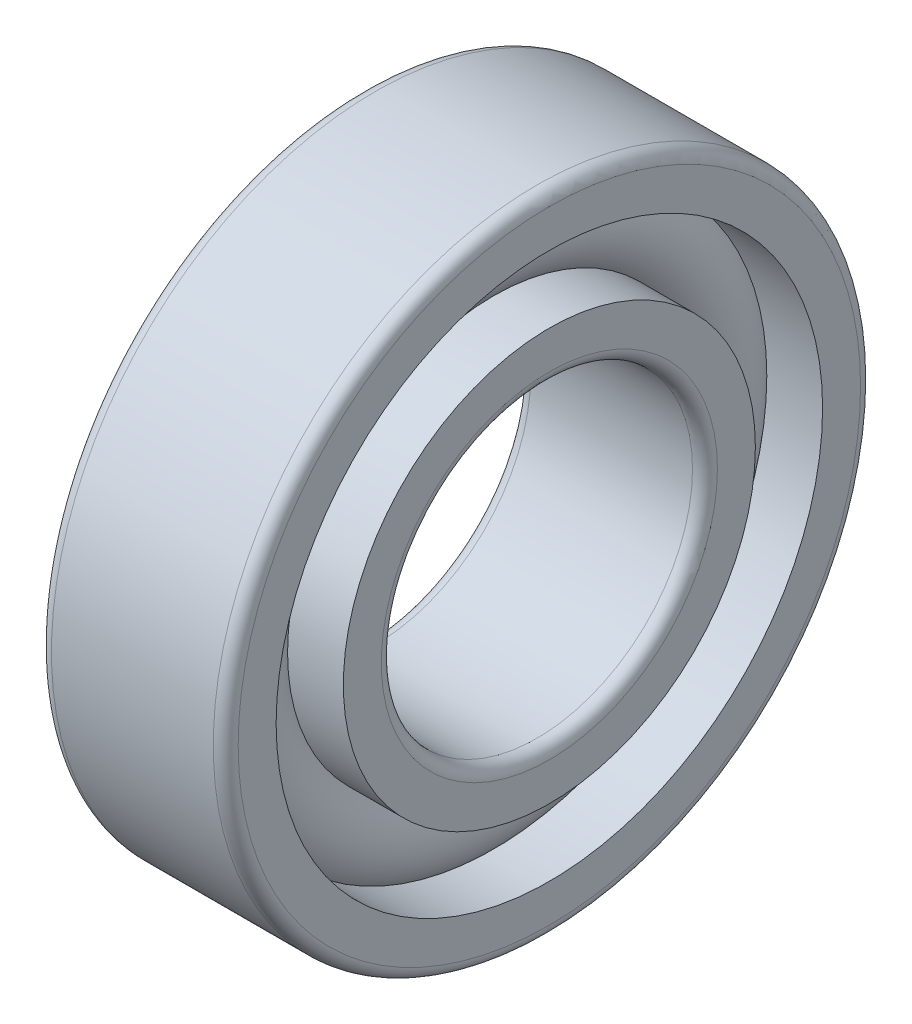
ISO-10303-21;
HEADER;
FILE_DESCRIPTION(('STEP AP214'),'2;1');
FILE_NAME('part.step','',(''),(''),'','','');
FILE_SCHEMA(('AUTOMOTIVE_DESIGN { 1 0 10303 214 1 1 1 1 }'));
ENDSEC;
DATA;
#1=APPLICATION_CONTEXT('core data for automotive mechanical design processes');
#2=APPLICATION_PROTOCOL_DEFINITION('international standard','automotive_design',2000,#1);
#3=PRODUCT_CONTEXT('',#1,'mechanical');
#4=PRODUCT('Part','Part','',(#3));
#5=PRODUCT_RELATED_PRODUCT_CATEGORY('part','',(#4));
#6=PRODUCT_DEFINITION_FORMATION('','',#4);
#7=PRODUCT_DEFINITION_CONTEXT('part definition',#1,'design');
#8=PRODUCT_DEFINITION('design','',#6,#7);
#9=PRODUCT_DEFINITION_SHAPE('','',#8);
#10=(LENGTH_UNIT() NAMED_UNIT(*) SI_UNIT(.MILLI.,.METRE.));
#11=(NAMED_UNIT(*) PLANE_ANGLE_UNIT() SI_UNIT($,.RADIAN.));
#12=(NAMED_UNIT(*) SI_UNIT($,.STERADIAN.) SOLID_ANGLE_UNIT());
#13=UNCERTAINTY_MEASURE_WITH_UNIT(LENGTH_MEASURE(1.E-05),#10,'distance_accuracy_value','');
#14=(GEOMETRIC_REPRESENTATION_CONTEXT(3) GLOBAL_UNCERTAINTY_ASSIGNED_CONTEXT((#13)) GLOBAL_UNIT_ASSIGNED_CONTEXT((#10,
#11,#12)) REPRESENTATION_CONTEXT('',''));
#15=CARTESIAN_POINT('',(0.,0.,0.));
#16=DIRECTION('',(0.,0.,1.));
#17=DIRECTION('',(1.,0.,0.));
#18=AXIS2_PLACEMENT_3D('',#15,#16,#17);
#19=CARTESIAN_POINT('',(0.,0.,0.));
#20=DIRECTION('',(-1.,0.,0.));
#21=DIRECTION('',(0.,0.,1.));
#22=AXIS2_PLACEMENT_3D('',#19,#20,#21);
#23=TOROIDAL_SURFACE('',#22,19.25,4.05);
#24=CARTESIAN_POINT('',(3.01869176962471,0.,0.));
#25=DIRECTION('',(-1.,0.,0.));
#26=DIRECTION('',(0.,0.,1.));
#27=AXIS2_PLACEMENT_3D('',#24,#25,#26);
#28=CIRCLE('',#27,21.95);
#29=CARTESIAN_POINT('',(3.01869176962471,0.,21.95));
#30=VERTEX_POINT('',#29);
#31=EDGE_CURVE('E35',#30,#30,#28,.F.);
#32=ORIENTED_EDGE('',*,*,#31,.T.);
#33=EDGE_LOOP('',(#32));
#34=FACE_BOUND('',#33,.T.);
#35=CARTESIAN_POINT('',(3.01869176962472,0.,0.));
#36=DIRECTION('',(-1.,0.,0.));
#37=DIRECTION('',(0.,0.,1.));
#38=AXIS2_PLACEMENT_3D('',#35,#36,#37);
#39=CIRCLE('',#38,16.55);
#40=CARTESIAN_POINT('',(3.01869176962472,0.,16.55));
#41=VERTEX_POINT('',#40);
#42=EDGE_CURVE('E10',#41,#41,#39,.T.);
#43=ORIENTED_EDGE('',*,*,#42,.T.);
#44=EDGE_LOOP('',(#43));
#45=FACE_BOUND('',#44,.T.);
#46=ADVANCED_FACE('F31',(#34,#45),#23,.T.);
#47=CARTESIAN_POINT('',(-20.6375,0.,0.));
#48=DIRECTION('',(1.,0.,0.));
#49=DIRECTION('',(0.,0.,-1.));
#50=AXIS2_PLACEMENT_3D('',#47,#48,#49);
#51=CYLINDRICAL_SURFACE('',#50,16.55);
#52=CARTESIAN_POINT('',(7.5,0.,0.));
#53=DIRECTION('',(1.,0.,0.));
#54=DIRECTION('',(0.,0.,-1.));
#55=AXIS2_PLACEMENT_3D('',#52,#53,#54);
#56=CIRCLE('',#55,16.55);
#57=CARTESIAN_POINT('',(7.5,0.,-16.55));
#58=VERTEX_POINT('',#57);
#59=EDGE_CURVE('E44',#58,#58,#56,.T.);
#60=ORIENTED_EDGE('',*,*,#59,.F.);
#61=EDGE_LOOP('',(#60));
#62=FACE_BOUND('',#61,.T.);
#63=ORIENTED_EDGE('',*,*,#42,.F.);
#64=EDGE_LOOP('',(#63));
#65=FACE_BOUND('',#64,.T.);
#66=ADVANCED_FACE('F83',(#62,#65),#51,.T.);
#67=CARTESIAN_POINT('',(-20.6375,0.,0.));
#68=DIRECTION('',(1.,0.,0.));
#69=DIRECTION('',(0.,0.,-1.));
#70=AXIS2_PLACEMENT_3D('',#67,#68,#69);
#71=CYLINDRICAL_SURFACE('',#70,16.55);
#72=CARTESIAN_POINT('',(-7.5,0.,0.));
#73=DIRECTION('',(1.,0.,0.));
#74=DIRECTION('',(0.,0.,-1.));
#75=AXIS2_PLACEMENT_3D('',#72,#73,#74);
#76=CIRCLE('',#75,16.55);
#77=CARTESIAN_POINT('',(-7.5,0.,-16.55));
#78=VERTEX_POINT('',#77);
#79=EDGE_CURVE('E53',#78,#78,#76,.T.);
#80=ORIENTED_EDGE('',*,*,#79,.T.);
#81=EDGE_LOOP('',(#80));
#82=FACE_BOUND('',#81,.T.);
#83=CARTESIAN_POINT('',(-3.01869176962472,0.,0.));
#84=DIRECTION('',(1.,0.,0.));
#85=DIRECTION('',(0.,0.,-1.));
#86=AXIS2_PLACEMENT_3D('',#83,#84,#85);
#87=CIRCLE('',#86,16.55);
#88=CARTESIAN_POINT('',(-3.01869176962472,0.,-16.55));
#89=VERTEX_POINT('',#88);
#90=EDGE_CURVE('E39',#89,#89,#87,.T.);
#91=ORIENTED_EDGE('',*,*,#90,.F.);
#92=EDGE_LOOP('',(#91));
#93=FACE_BOUND('',#92,.T.);
#94=ADVANCED_FACE('F86',(#82,#93),#71,.T.);
#95=CARTESIAN_POINT('',(7.5,13.5,0.));
#96=DIRECTION('',(1.,0.,0.));
#97=DIRECTION('',(0.,0.,-1.));
#98=AXIS2_PLACEMENT_3D('',#95,#96,#97);
#99=PLANE('',#98);
#100=ORIENTED_EDGE('',*,*,#59,.T.);
#101=EDGE_LOOP('',(#100));
#102=FACE_BOUND('',#101,.T.);
#103=CARTESIAN_POINT('',(7.5,0.,0.));
#104=DIRECTION('',(1.,0.,0.));
#105=DIRECTION('',(0.,0.,-1.));
#106=AXIS2_PLACEMENT_3D('',#103,#104,#105);
#107=CIRCLE('',#106,13.5);
#108=CARTESIAN_POINT('',(7.5,0.,-13.5));
#109=VERTEX_POINT('',#108);
#110=EDGE_CURVE('E75',#109,#109,#107,.T.);
#111=ORIENTED_EDGE('',*,*,#110,.F.);
#112=EDGE_LOOP('',(#111));
#113=FACE_BOUND('',#112,.T.);
#114=ADVANCED_FACE('F80',(#102,#113),#99,.T.);
#115=CARTESIAN_POINT('',(6.5,0.,0.));
#116=DIRECTION('',(1.,0.,0.));
#117=DIRECTION('',(0.,0.,-1.));
#118=AXIS2_PLACEMENT_3D('',#115,#116,#117);
#119=TOROIDAL_SURFACE('',#118,13.5,1.);
#120=ORIENTED_EDGE('',*,*,#110,.T.);
#121=EDGE_LOOP('',(#120));
#122=FACE_BOUND('',#121,.T.);
#123=CARTESIAN_POINT('',(6.5,0.,0.));
#124=DIRECTION('',(1.,0.,0.));
#125=DIRECTION('',(0.,0.,-1.));
#126=AXIS2_PLACEMENT_3D('',#123,#124,#125);
#127=CIRCLE('',#126,12.5);
#128=CARTESIAN_POINT('',(6.5,0.,-12.5));
#129=VERTEX_POINT('',#128);
#130=EDGE_CURVE('E72',#129,#129,#127,.T.);
#131=ORIENTED_EDGE('',*,*,#130,.F.);
#132=EDGE_LOOP('',(#131));
#133=FACE_BOUND('',#132,.T.);
#134=ADVANCED_FACE('F97',(#122,#133),#119,.T.);
#135=CARTESIAN_POINT('',(-20.6375,0.,0.));
#136=DIRECTION('',(1.,0.,0.));
#137=DIRECTION('',(0.,0.,-1.));
#138=AXIS2_PLACEMENT_3D('',#135,#136,#137);
#139=CYLINDRICAL_SURFACE('',#138,12.5);
#140=ORIENTED_EDGE('',*,*,#130,.T.);
#141=EDGE_LOOP('',(#140));
#142=FACE_BOUND('',#141,.T.);
#143=CARTESIAN_POINT('',(-6.5,0.,0.));
#144=DIRECTION('',(1.,0.,0.));
#145=DIRECTION('',(0.,0.,-1.));
#146=AXIS2_PLACEMENT_3D('',#143,#144,#145);
#147=CIRCLE('',#146,12.5);
#148=CARTESIAN_POINT('',(-6.5,0.,-12.5));
#149=VERTEX_POINT('',#148);
#150=EDGE_CURVE('E69',#149,#149,#147,.T.);
#151=ORIENTED_EDGE('',*,*,#150,.F.);
#152=EDGE_LOOP('',(#151));
#153=FACE_BOUND('',#152,.T.);
#154=ADVANCED_FACE('F100',(#142,#153),#139,.F.);
#155=CARTESIAN_POINT('',(-6.5,0.,0.));
#156=DIRECTION('',(1.,0.,0.));
#157=DIRECTION('',(0.,0.,-1.));
#158=AXIS2_PLACEMENT_3D('',#155,#156,#157);
#159=TOROIDAL_SURFACE('',#158,13.5,1.);
#160=ORIENTED_EDGE('',*,*,#150,.T.);
#161=EDGE_LOOP('',(#160));
#162=FACE_BOUND('',#161,.T.);
#163=CARTESIAN_POINT('',(-7.5,0.,0.));
#164=DIRECTION('',(1.,0.,0.));
#165=DIRECTION('',(0.,0.,-1.));
#166=AXIS2_PLACEMENT_3D('',#163,#164,#165);
#167=CIRCLE('',#166,13.5);
#168=CARTESIAN_POINT('',(-7.5,0.,-13.5));
#169=VERTEX_POINT('',#168);
#170=EDGE_CURVE('E66',#169,#169,#167,.T.);
#171=ORIENTED_EDGE('',*,*,#170,.F.);
#172=EDGE_LOOP('',(#171));
#173=FACE_BOUND('',#172,.T.);
#174=ADVANCED_FACE('F104',(#162,#173),#159,.T.);
#175=CARTESIAN_POINT('',(-7.5,16.55,0.));
#176=DIRECTION('',(-1.,0.,0.));
#177=DIRECTION('',(0.,0.,1.));
#178=AXIS2_PLACEMENT_3D('',#175,#176,#177);
#179=PLANE('',#178);
#180=ORIENTED_EDGE('',*,*,#170,.T.);
#181=EDGE_LOOP('',(#180));
#182=FACE_BOUND('',#181,.T.);
#183=ORIENTED_EDGE('',*,*,#79,.F.);
#184=EDGE_LOOP('',(#183));
#185=FACE_BOUND('',#184,.T.);
#186=ADVANCED_FACE('F108',(#182,#185),#179,.T.);
#187=CARTESIAN_POINT('',(-3.01869176962471,0.,0.));
#188=DIRECTION('',(1.,0.,0.));
#189=DIRECTION('',(0.,0.,-1.));
#190=AXIS2_PLACEMENT_3D('',#187,#188,#189);
#191=CIRCLE('',#190,21.95);
#192=CARTESIAN_POINT('',(-3.01869176962471,0.,-21.95));
#193=VERTEX_POINT('',#192);
#194=EDGE_CURVE('E47',#193,#193,#191,.F.);
#195=ORIENTED_EDGE('',*,*,#194,.T.);
#196=EDGE_LOOP('',(#195));
#197=FACE_BOUND('',#196,.T.);
#198=ORIENTED_EDGE('',*,*,#90,.T.);
#199=EDGE_LOOP('',(#198));
#200=FACE_BOUND('',#199,.T.);
#201=ADVANCED_FACE('F33',(#197,#200),#23,.T.);
#202=CARTESIAN_POINT('',(-20.6375,0.,0.));
#203=DIRECTION('',(1.,0.,0.));
#204=DIRECTION('',(0.,0.,-1.));
#205=AXIS2_PLACEMENT_3D('',#202,#203,#204);
#206=CYLINDRICAL_SURFACE('',#205,21.95);
#207=CARTESIAN_POINT('',(7.5,0.,0.));
#208=DIRECTION('',(1.,0.,0.));
#209=DIRECTION('',(0.,0.,-1.));
#210=AXIS2_PLACEMENT_3D('',#207,#208,#209);
#211=CIRCLE('',#210,21.95);
#212=CARTESIAN_POINT('',(7.5,0.,-21.95));
#213=VERTEX_POINT('',#212);
#214=EDGE_CURVE('E49',#213,#213,#211,.T.);
#215=ORIENTED_EDGE('',*,*,#214,.T.);
#216=EDGE_LOOP('',(#215));
#217=FACE_BOUND('',#216,.T.);
#218=ORIENTED_EDGE('',*,*,#31,.F.);
#219=EDGE_LOOP('',(#218));
#220=FACE_BOUND('',#219,.T.);
#221=ADVANCED_FACE('F113',(#217,#220),#206,.F.);
#222=CARTESIAN_POINT('',(-20.6375,0.,0.));
#223=DIRECTION('',(1.,0.,0.));
#224=DIRECTION('',(0.,0.,-1.));
#225=AXIS2_PLACEMENT_3D('',#222,#223,#224);
#226=CYLINDRICAL_SURFACE('',#225,21.95);
#227=CARTESIAN_POINT('',(-7.5,0.,0.));
#228=DIRECTION('',(1.,0.,0.));
#229=DIRECTION('',(0.,0.,-1.));
#230=AXIS2_PLACEMENT_3D('',#227,#228,#229);
#231=CIRCLE('',#230,21.95);
#232=CARTESIAN_POINT('',(-7.5,0.,-21.95));
#233=VERTEX_POINT('',#232);
#234=EDGE_CURVE('E144',#233,#233,#231,.T.);
#235=ORIENTED_EDGE('',*,*,#234,.F.);
#236=EDGE_LOOP('',(#235));
#237=FACE_BOUND('',#236,.T.);
#238=ORIENTED_EDGE('',*,*,#194,.F.);
#239=EDGE_LOOP('',(#238));
#240=FACE_BOUND('',#239,.T.);
#241=ADVANCED_FACE('F116',(#237,#240),#226,.F.);
#242=CARTESIAN_POINT('',(7.5,25.,0.));
#243=DIRECTION('',(1.,0.,0.));
#244=DIRECTION('',(0.,0.,-1.));
#245=AXIS2_PLACEMENT_3D('',#242,#243,#244);
#246=PLANE('',#245);
#247=CARTESIAN_POINT('',(7.5,0.,0.));
#248=DIRECTION('',(1.,0.,0.));
#249=DIRECTION('',(0.,0.,-1.));
#250=AXIS2_PLACEMENT_3D('',#247,#248,#249);
#251=CIRCLE('',#250,25.);
#252=CARTESIAN_POINT('',(7.5,0.,-25.));
#253=VERTEX_POINT('',#252);
#254=EDGE_CURVE('E55',#253,#253,#251,.T.);
#255=ORIENTED_EDGE('',*,*,#254,.T.);
#256=EDGE_LOOP('',(#255));
#257=FACE_BOUND('',#256,.T.);
#258=ORIENTED_EDGE('',*,*,#214,.F.);
#259=EDGE_LOOP('',(#258));
#260=FACE_BOUND('',#259,.T.);
#261=ADVANCED_FACE('F117',(#257,#260),#246,.T.);
#262=CARTESIAN_POINT('',(6.5,0.,0.));
#263=DIRECTION('',(1.,0.,0.));
#264=DIRECTION('',(0.,0.,-1.));
#265=AXIS2_PLACEMENT_3D('',#262,#263,#264);
#266=TOROIDAL_SURFACE('',#265,25.,0.999999999999999);
#267=CARTESIAN_POINT('',(6.5,0.,0.));
#268=DIRECTION('',(1.,0.,0.));
#269=DIRECTION('',(0.,0.,-1.));
#270=AXIS2_PLACEMENT_3D('',#267,#268,#269);
#271=CIRCLE('',#270,26.);
#272=CARTESIAN_POINT('',(6.5,0.,-26.));
#273=VERTEX_POINT('',#272);
#274=EDGE_CURVE('E60',#273,#273,#271,.T.);
#275=ORIENTED_EDGE('',*,*,#274,.T.);
#276=EDGE_LOOP('',(#275));
#277=FACE_BOUND('',#276,.T.);
#278=ORIENTED_EDGE('',*,*,#254,.F.);
#279=EDGE_LOOP('',(#278));
#280=FACE_BOUND('',#279,.T.);
#281=ADVANCED_FACE('F120',(#277,#280),#266,.T.);
#282=CARTESIAN_POINT('',(-20.6375,0.,0.));
#283=DIRECTION('',(1.,0.,0.));
#284=DIRECTION('',(0.,0.,-1.));
#285=AXIS2_PLACEMENT_3D('',#282,#283,#284);
#286=CYLINDRICAL_SURFACE('',#285,26.);
#287=CARTESIAN_POINT('',(-6.5,0.,0.));
#288=DIRECTION('',(1.,0.,0.));
#289=DIRECTION('',(0.,0.,-1.));
#290=AXIS2_PLACEMENT_3D('',#287,#288,#289);
#291=CIRCLE('',#290,26.);
#292=CARTESIAN_POINT('',(-6.5,0.,-26.));
#293=VERTEX_POINT('',#292);
#294=EDGE_CURVE('E148',#293,#293,#291,.T.);
#295=ORIENTED_EDGE('',*,*,#294,.T.);
#296=EDGE_LOOP('',(#295));
#297=FACE_BOUND('',#296,.T.);
#298=ORIENTED_EDGE('',*,*,#274,.F.);
#299=EDGE_LOOP('',(#298));
#300=FACE_BOUND('',#299,.T.);
#301=ADVANCED_FACE('F124',(#297,#300),#286,.T.);
#302=CARTESIAN_POINT('',(-6.5,0.,0.));
#303=DIRECTION('',(1.,0.,0.));
#304=DIRECTION('',(0.,0.,-1.));
#305=AXIS2_PLACEMENT_3D('',#302,#303,#304);
#306=TOROIDAL_SURFACE('',#305,25.,0.999999999999999);
#307=CARTESIAN_POINT('',(-7.5,0.,0.));
#308=DIRECTION('',(1.,0.,0.));
#309=DIRECTION('',(0.,0.,-1.));
#310=AXIS2_PLACEMENT_3D('',#307,#308,#309);
#311=CIRCLE('',#310,25.);
#312=CARTESIAN_POINT('',(-7.5,0.,-25.));
#313=VERTEX_POINT('',#312);
#314=EDGE_CURVE('E145',#313,#313,#311,.T.);
#315=ORIENTED_EDGE('',*,*,#314,.T.);
#316=EDGE_LOOP('',(#315));
#317=FACE_BOUND('',#316,.T.);
#318=ORIENTED_EDGE('',*,*,#294,.F.);
#319=EDGE_LOOP('',(#318));
#320=FACE_BOUND('',#319,.T.);
#321=ADVANCED_FACE('F128',(#317,#320),#306,.T.);
#322=CARTESIAN_POINT('',(-7.5,21.95,0.));
#323=DIRECTION('',(-1.,0.,0.));
#324=DIRECTION('',(0.,0.,1.));
#325=AXIS2_PLACEMENT_3D('',#322,#323,#324);
#326=PLANE('',#325);
#327=ORIENTED_EDGE('',*,*,#234,.T.);
#328=EDGE_LOOP('',(#327));
#329=FACE_BOUND('',#328,.T.);
#330=ORIENTED_EDGE('',*,*,#314,.F.);
#331=EDGE_LOOP('',(#330));
#332=FACE_BOUND('',#331,.T.);
#333=ADVANCED_FACE('F132',(#329,#332),#326,.T.);
#334=CLOSED_SHELL('',(#46,#66,#94,#114,#134,#154,#174,#186,#201,#221,#241,#261,#281,#301,#321,#333));
#335=MANIFOLD_SOLID_BREP('B2',#334);
#336=ADVANCED_BREP_SHAPE_REPRESENTATION('',(#18,#335),#14);
#337=SHAPE_DEFINITION_REPRESENTATION(#9,#336);
ENDSEC;
END-ISO-10303-21;
